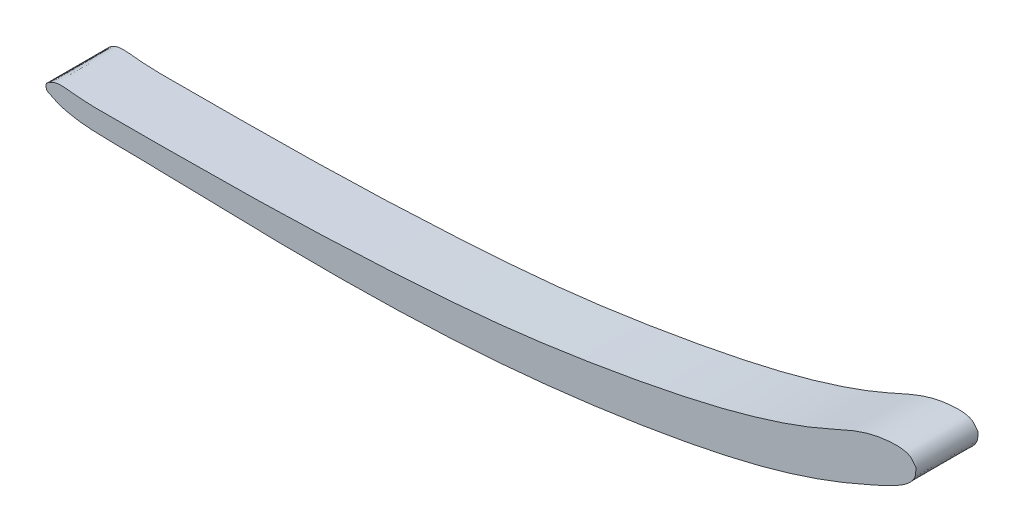
ISO-10303-21;
HEADER;
FILE_DESCRIPTION(('STEP AP214'),'2;1');
FILE_NAME('part.step','',(''),(''),'','','');
FILE_SCHEMA(('AUTOMOTIVE_DESIGN { 1 0 10303 214 1 1 1 1 }'));
ENDSEC;
DATA;
#1=APPLICATION_CONTEXT('core data for automotive mechanical design processes');
#2=APPLICATION_PROTOCOL_DEFINITION('international standard','automotive_design',2000,#1);
#3=PRODUCT_CONTEXT('',#1,'mechanical');
#4=PRODUCT('Part','Part','',(#3));
#5=PRODUCT_RELATED_PRODUCT_CATEGORY('part','',(#4));
#6=PRODUCT_DEFINITION_FORMATION('','',#4);
#7=PRODUCT_DEFINITION_CONTEXT('part definition',#1,'design');
#8=PRODUCT_DEFINITION('design','',#6,#7);
#9=PRODUCT_DEFINITION_SHAPE('','',#8);
#10=(LENGTH_UNIT() NAMED_UNIT(*) SI_UNIT(.MILLI.,.METRE.));
#11=(NAMED_UNIT(*) PLANE_ANGLE_UNIT() SI_UNIT($,.RADIAN.));
#12=(NAMED_UNIT(*) SI_UNIT($,.STERADIAN.) SOLID_ANGLE_UNIT());
#13=UNCERTAINTY_MEASURE_WITH_UNIT(LENGTH_MEASURE(1.E-05),#10,'distance_accuracy_value','');
#14=(GEOMETRIC_REPRESENTATION_CONTEXT(3) GLOBAL_UNCERTAINTY_ASSIGNED_CONTEXT((#13)) GLOBAL_UNIT_ASSIGNED_CONTEXT((#10,
#11,#12)) REPRESENTATION_CONTEXT('',''));
#15=CARTESIAN_POINT('',(0.,0.,0.));
#16=DIRECTION('',(0.,0.,1.));
#17=DIRECTION('',(1.,0.,0.));
#18=AXIS2_PLACEMENT_3D('',#15,#16,#17);
#19=CARTESIAN_POINT('',(51.0593514216579,0.,444.));
#20=CARTESIAN_POINT('',(51.0408393798769,0.0756062276242309,444.));
#21=CARTESIAN_POINT('',(50.9959182037949,0.138901396177157,444.));
#22=CARTESIAN_POINT('',(50.9011827807727,0.259665454383967,444.));
#23=CARTESIAN_POINT('',(50.8502622702264,0.317059667251623,444.));
#24=CARTESIAN_POINT('',(50.7012943591155,0.492432647017621,444.));
#25=CARTESIAN_POINT('',(50.6026258318228,0.611174293313033,444.));
#26=CARTESIAN_POINT('',(50.4368862485133,0.768409018394423,444.));
#27=CARTESIAN_POINT('',(50.3790864703461,0.817579181589201,444.));
#28=CARTESIAN_POINT('',(50.2545565695869,0.904582224288797,444.));
#29=CARTESIAN_POINT('',(50.1876959812607,0.942962253995774,444.));
#30=CARTESIAN_POINT('',(49.9788053204208,1.04279111512755,444.));
#31=CARTESIAN_POINT('',(49.8331340594548,1.08753760717468,444.));
#32=CARTESIAN_POINT('',(49.5356805351122,1.15624432500802,444.));
#33=CARTESIAN_POINT('',(49.3832322594025,1.1795610472741,444.));
#34=CARTESIAN_POINT('',(49.0800936413062,1.21444227965473,444.));
#35=CARTESIAN_POINT('',(48.9285952093711,1.22567965297453,444.));
#36=CARTESIAN_POINT('',(48.4742869094483,1.24302568772786,444.));
#37=CARTESIAN_POINT('',(48.1716470755255,1.23425278084605,444.));
#38=CARTESIAN_POINT('',(47.2640570461538,1.17909827380079,444.));
#39=CARTESIAN_POINT('',(46.6575695003602,1.09825145199031,444.));
#40=CARTESIAN_POINT('',(45.4720954086965,0.871934228606083,444.));
#41=CARTESIAN_POINT('',(44.8902140927814,0.723727884275258,444.));
#42=CARTESIAN_POINT('',(43.1750079301051,0.180840438068999,444.));
#43=CARTESIAN_POINT('',(42.0692648444786,-0.303386137989248,444.));
#44=CARTESIAN_POINT('',(39.8636503340226,-1.28855438392098,444.));
#45=CARTESIAN_POINT('',(38.7605059553471,-1.78020460474326,444.));
#46=CARTESIAN_POINT('',(36.5246308861651,-2.68154480231819,444.));
#47=CARTESIAN_POINT('',(35.3933300323557,-3.09519572443481,444.));
#48=CARTESIAN_POINT('',(33.1126356565822,-3.87237711072388,444.));
#49=CARTESIAN_POINT('',(31.9633450851073,-4.23619276918752,444.));
#50=CARTESIAN_POINT('',(29.6517074690219,-4.92765493698269,444.));
#51=CARTESIAN_POINT('',(28.4882151645929,-5.25408741052308,444.));
#52=CARTESIAN_POINT('',(26.1519977262055,-5.86745777659797,444.));
#53=CARTESIAN_POINT('',(24.9791742201242,-6.1550286912202,444.));
#54=CARTESIAN_POINT('',(21.4498923606462,-6.97391105988387,444.));
#55=CARTESIAN_POINT('',(19.0842597373433,-7.46462804151096,444.));
#56=CARTESIAN_POINT('',(14.3414536751976,-8.3745975061382,444.));
#57=CARTESIAN_POINT('',(11.9631499765223,-8.79293472418868,444.));
#58=CARTESIAN_POINT('',(7.19502192095206,-9.56842616891049,444.));
#59=CARTESIAN_POINT('',(4.80601582892226,-9.92510311757525,444.));
#60=CARTESIAN_POINT('',(0.0162993345377976,-10.5561520012107,444.));
#61=CARTESIAN_POINT('',(-2.38294583312734,-10.8273785967303,444.));
#62=CARTESIAN_POINT('',(-7.18983674924165,-11.2850051676654,444.));
#63=CARTESIAN_POINT('',(-9.59769306684337,-11.4729192053696,444.));
#64=CARTESIAN_POINT('',(-14.4167871780939,-11.7978646046983,444.));
#65=CARTESIAN_POINT('',(-16.8273017984838,-11.9363800811893,444.));
#66=CARTESIAN_POINT('',(-21.6495384580478,-12.1835149462487,444.));
#67=CARTESIAN_POINT('',(-24.0613142617866,-12.290803106434,444.));
#68=CARTESIAN_POINT('',(-28.8865195992256,-12.4644325267137,444.));
#69=CARTESIAN_POINT('',(-31.2999555929873,-12.530613833549,444.));
#70=CARTESIAN_POINT('',(-36.1283393208823,-12.6255452562685,444.));
#71=CARTESIAN_POINT('',(-38.5433423478169,-12.6547179827178,444.));
#72=CARTESIAN_POINT('',(-43.3732850317947,-12.6976528765733,444.));
#73=CARTESIAN_POINT('',(-45.7883074208213,-12.713090321412,444.));
#74=CARTESIAN_POINT('',(-49.4108658567439,-12.7301233535666,444.));
#75=CARTESIAN_POINT('',(-50.6183963970574,-12.7340299513783,444.));
#76=CARTESIAN_POINT('',(-52.4296948655007,-12.7334552918043,444.));
#77=CARTESIAN_POINT('',(-53.0334634876988,-12.7341284211406,444.));
#78=CARTESIAN_POINT('',(-54.2409804475092,-12.72836220265,444.));
#79=CARTESIAN_POINT('',(-54.8449700787845,-12.7223191022672,444.));
#80=CARTESIAN_POINT('',(-56.0505622332064,-12.6749283400332,444.));
#81=CARTESIAN_POINT('',(-56.65235286349,-12.6351331299431,444.));
#82=CARTESIAN_POINT('',(-57.8531807766124,-12.5114544324461,444.));
#83=CARTESIAN_POINT('',(-58.4524483100156,-12.425178931146,444.));
#84=CARTESIAN_POINT('',(-59.3567262547239,-12.4297231719929,444.));
#85=CARTESIAN_POINT('',(-59.6636444213334,-12.4562469102543,444.));
#86=CARTESIAN_POINT('',(-60.0925168667073,-12.5918230415854,444.));
#87=CARTESIAN_POINT('',(-60.2311444676702,-12.6549428996684,444.));
#88=CARTESIAN_POINT('',(-60.4985770861348,-12.801169870921,444.));
#89=CARTESIAN_POINT('',(-60.6264445110533,-12.8841843652963,444.));
#90=CARTESIAN_POINT('',(-60.8161373711667,-13.0119939986879,444.));
#91=CARTESIAN_POINT('',(-60.880800429903,-13.0555216346178,444.));
#92=CARTESIAN_POINT('',(-60.9748099318818,-13.1740473989639,444.));
#93=CARTESIAN_POINT('',(-61.0037363499786,-13.2481436679429,444.));
#94=CARTESIAN_POINT('',(-61.0229521376291,-13.3989372395297,444.));
#95=CARTESIAN_POINT('',(-61.0146292235168,-13.4748475629253,444.));
#96=CARTESIAN_POINT('',(-60.9982646775088,-13.6259380644475,444.));
#97=CARTESIAN_POINT('',(-60.9868981725538,-13.7019070665447,444.));
#98=CARTESIAN_POINT('',(-60.9381944627111,-13.8454389020756,444.));
#99=CARTESIAN_POINT('',(-60.897920599721,-13.9126087594414,444.));
#100=CARTESIAN_POINT('',(-60.7790963428574,-14.0088745454242,444.));
#101=CARTESIAN_POINT('',(-60.7102501702357,-14.0399131725784,444.));
#102=CARTESIAN_POINT('',(-60.5721181419146,-14.1011937315078,444.));
#103=CARTESIAN_POINT('',(-60.502863354517,-14.1314880897842,444.));
#104=CARTESIAN_POINT('',(-60.3665972652445,-14.1967114411682,444.));
#105=CARTESIAN_POINT('',(-60.2989966974578,-14.2304337915973,444.));
#106=CARTESIAN_POINT('',(-60.0969752167291,-14.3332282818373,444.));
#107=CARTESIAN_POINT('',(-59.9633135084408,-14.4038840199395,444.));
#108=CARTESIAN_POINT('',(-59.6909196120011,-14.5346191604885,444.));
#109=CARTESIAN_POINT('',(-59.5514309769309,-14.5941661897652,444.));
#110=CARTESIAN_POINT('',(-59.1292254741715,-14.7552071278612,444.));
#111=CARTESIAN_POINT('',(-58.8431098222935,-14.8413056604456,444.));
#112=CARTESIAN_POINT('',(-57.9780813727092,-15.0690193725004,444.));
#113=CARTESIAN_POINT('',(-57.3923634598421,-15.1794868392656,444.));
#114=CARTESIAN_POINT('',(-56.2068879267632,-15.3361605868355,444.));
#115=CARTESIAN_POINT('',(-55.6075599012478,-15.3829476496219,444.));
#116=CARTESIAN_POINT('',(-54.411156281399,-15.4480922448599,444.));
#117=CARTESIAN_POINT('',(-53.8123452626019,-15.4663319383334,444.));
#118=CARTESIAN_POINT('',(-52.0151867764723,-15.5039841345761,444.));
#119=CARTESIAN_POINT('',(-50.8164460265298,-15.5110205731138,444.));
#120=CARTESIAN_POINT('',(-48.4194461456832,-15.5380006315566,444.));
#121=CARTESIAN_POINT('',(-47.2210115479603,-15.5558505370189,444.));
#122=CARTESIAN_POINT('',(-43.6259626732439,-15.6264092367086,444.));
#123=CARTESIAN_POINT('',(-41.229578192644,-15.6916579625873,444.));
#124=CARTESIAN_POINT('',(-36.4367054159065,-15.8144282369873,444.));
#125=CARTESIAN_POINT('',(-34.0401534917351,-15.8704085449361,444.));
#126=CARTESIAN_POINT('',(-26.8493637999602,-15.9853040937488,444.));
#127=CARTESIAN_POINT('',(-22.0547558851412,-15.9898924230387,444.));
#128=CARTESIAN_POINT('',(-12.4697001875732,-15.7623410606474,444.));
#129=CARTESIAN_POINT('',(-7.679179465265,-15.5362740692693,444.));
#130=CARTESIAN_POINT('',(1.87731538954823,-14.7834302293905,444.));
#131=CARTESIAN_POINT('',(6.64675655678977,-14.2562719318843,444.));
#132=CARTESIAN_POINT('',(13.7687398936705,-13.2582502207188,444.));
#133=CARTESIAN_POINT('',(16.1368157057646,-12.890566679725,444.));
#134=CARTESIAN_POINT('',(20.8601333704666,-12.079284732611,444.));
#135=CARTESIAN_POINT('',(23.215548510165,-11.6345228337592,444.));
#136=CARTESIAN_POINT('',(27.9060145830239,-10.6336113763827,444.));
#137=CARTESIAN_POINT('',(30.2372702954241,-10.0771713544806,444.));
#138=CARTESIAN_POINT('',(34.8573417619791,-8.79430376073975,444.));
#139=CARTESIAN_POINT('',(37.1442453216568,-8.06722051173042,444.));
#140=CARTESIAN_POINT('',(41.6470420137467,-6.41414633903081,444.));
#141=CARTESIAN_POINT('',(43.8622961061986,-5.48966448349994,444.));
#142=CARTESIAN_POINT('',(46.5887594975215,-4.24194506238798,444.));
#143=CARTESIAN_POINT('',(47.1320635782808,-3.98777199104919,444.));
#144=CARTESIAN_POINT('',(47.9377017946104,-3.58793746054889,444.));
#145=CARTESIAN_POINT('',(48.2045691876618,-3.45093018282644,444.));
#146=CARTESIAN_POINT('',(48.7315143959145,-3.16463704161449,444.));
#147=CARTESIAN_POINT('',(48.9915502734107,-3.01622932215589,444.));
#148=CARTESIAN_POINT('',(49.4963234073578,-2.6959938294423,444.));
#149=CARTESIAN_POINT('',(49.7411290010227,-2.524270670925,444.));
#150=CARTESIAN_POINT('',(50.2039624656595,-2.13983139745658,444.));
#151=CARTESIAN_POINT('',(50.4183180413865,-1.92789852878916,444.));
#152=CARTESIAN_POINT('',(50.6966382249769,-1.57257953735229,444.));
#153=CARTESIAN_POINT('',(50.7824048017047,-1.44757786808697,444.));
#154=CARTESIAN_POINT('',(50.9247009828561,-1.18371931924835,444.));
#155=CARTESIAN_POINT('',(50.9830052702174,-1.0412630449034,444.));
#156=CARTESIAN_POINT('',(51.0423500137643,-0.748895987657039,444.));
#157=CARTESIAN_POINT('',(51.0439301613678,-0.598896034571195,444.));
#158=CARTESIAN_POINT('',(51.0504851131704,-0.374329118797118,444.));
#159=CARTESIAN_POINT('',(51.0560954820982,-0.29955821724087,444.));
#160=CARTESIAN_POINT('',(51.068519282998,-0.15004617545343,444.));
#161=CARTESIAN_POINT('',(51.0778634634388,-0.0756062276242309,444.));
#162=CARTESIAN_POINT('',(51.0593514216579,0.,444.));
#163=B_SPLINE_CURVE_WITH_KNOTS('',3,(#19,#20,#21,#22,#23,#24,#25,#26,#27,#28,#29,#30,#31,#32,
#33,#34,#35,#36,#37,#38,#39,#40,#41,#42,#43,#44,#45,#46,#47,#48,#49,#50,#51,#52,#53,#54,#55,#56,
#57,#58,#59,#60,#61,#62,#63,#64,#65,#66,#67,#68,#69,#70,#71,#72,#73,#74,#75,#76,#77,#78,#79,#80,
#81,#82,#83,#84,#85,#86,#87,#88,#89,#90,#91,#92,#93,#94,#95,#96,#97,#98,#99,#100,#101,#102,#103,
#104,#105,#106,#107,#108,#109,#110,#111,#112,#113,#114,#115,#116,#117,#118,#119,#120,#121,#122,
#123,#124,#125,#126,#127,#128,#129,#130,#131,#132,#133,#134,#135,#136,#137,#138,#139,#140,#141,
#142,#143,#144,#145,#146,#147,#148,#149,#150,#151,#152,#153,#154,#155,#156,#157,#158,#159,#160,
#161,#162),.UNSPECIFIED.,.T.,.F.,(4,2,2,2,2,2,2,2,2,2,2,2,2,2,2,2,2,2,2,2,2,2,2,2,2,2,2,2,2,2,2,
2,2,2,2,2,2,2,2,2,2,2,2,2,2,2,2,2,2,2,2,2,2,2,2,2,2,2,2,2,2,2,2,2,2,2,2,2,2,2,2,4),(0.,
0.000976562499999973,0.00195312499999995,0.00390624999999989,0.0048828124999999,
0.0058593749999999,0.00781249999999991,0.00976562499999993,0.0117187499999999,0.015625,
0.0234375000000001,0.0312500000000002,0.0468750000000004,0.0625000000000006,0.0781250000000008,
0.0937500000000009,0.109375000000001,0.125000000000001,0.156250000000002,0.187500000000002,
0.218750000000002,0.250000000000003,0.281250000000003,0.312500000000004,0.343750000000004,
0.375000000000004,0.406250000000005,0.437500000000005,0.453125000000005,0.460937500000006,
0.468750000000006,0.476562500000006,0.484375000000006,0.488281250000006,0.490234375000006,
0.492187500000006,0.493164062500006,0.494140625000006,0.495117187500006,0.496093750000006,
0.497070312500006,0.498046875000006,0.499023437500006,0.500000000000006,0.501953125000006,
0.503906250000006,0.507812500000006,0.515625000000005,0.523437500000005,0.531250000000005,
0.546875000000005,0.562500000000005,0.593750000000005,0.625000000000004,0.687500000000004,
0.750000000000003,0.812500000000002,0.843750000000002,0.875000000000002,0.906250000000001,
0.937500000000001,0.968750000000001,0.976562500000001,0.980468750000001,0.984375,0.98828125,
0.9921875,0.994140625,0.99609375,0.998046875,0.9990234375,1.),.UNSPECIFIED.);
#164=DIRECTION('',(0.,0.,-1.));
#165=VECTOR('',#164,1.);
#166=SURFACE_OF_LINEAR_EXTRUSION('',#163,#165);
#167=CARTESIAN_POINT('',(51.0593514216579,0.,444.));
#168=CARTESIAN_POINT('',(51.0778634634388,-0.0756062276242309,444.));
#169=CARTESIAN_POINT('',(51.068519282998,-0.15004617545343,444.));
#170=CARTESIAN_POINT('',(51.0560954820982,-0.29955821724087,444.));
#171=CARTESIAN_POINT('',(51.0504851131704,-0.374329118797118,444.));
#172=CARTESIAN_POINT('',(51.0439301613678,-0.598896034571195,444.));
#173=CARTESIAN_POINT('',(51.0423500137643,-0.748895987657039,444.));
#174=CARTESIAN_POINT('',(50.9830052702174,-1.0412630449034,444.));
#175=CARTESIAN_POINT('',(50.9247009828561,-1.18371931924835,444.));
#176=CARTESIAN_POINT('',(50.7824048017047,-1.44757786808697,444.));
#177=CARTESIAN_POINT('',(50.6966382249769,-1.57257953735229,444.));
#178=CARTESIAN_POINT('',(50.4183180413865,-1.92789852878916,444.));
#179=CARTESIAN_POINT('',(50.2039624656595,-2.13983139745658,444.));
#180=CARTESIAN_POINT('',(49.7411290010227,-2.524270670925,444.));
#181=CARTESIAN_POINT('',(49.4963234073578,-2.6959938294423,444.));
#182=CARTESIAN_POINT('',(48.9915502734107,-3.01622932215589,444.));
#183=CARTESIAN_POINT('',(48.7315143959145,-3.16463704161449,444.));
#184=CARTESIAN_POINT('',(48.2045691876618,-3.45093018282644,444.));
#185=CARTESIAN_POINT('',(47.9377017946104,-3.58793746054889,444.));
#186=CARTESIAN_POINT('',(47.1320635782808,-3.98777199104919,444.));
#187=CARTESIAN_POINT('',(46.5887594975215,-4.24194506238798,444.));
#188=CARTESIAN_POINT('',(43.8622961061986,-5.48966448349994,444.));
#189=CARTESIAN_POINT('',(41.6470420137467,-6.41414633903081,444.));
#190=CARTESIAN_POINT('',(37.1442453216568,-8.06722051173042,444.));
#191=CARTESIAN_POINT('',(34.8573417619791,-8.79430376073975,444.));
#192=CARTESIAN_POINT('',(30.2372702954241,-10.0771713544806,444.));
#193=CARTESIAN_POINT('',(27.9060145830239,-10.6336113763827,444.));
#194=CARTESIAN_POINT('',(23.215548510165,-11.6345228337592,444.));
#195=CARTESIAN_POINT('',(20.8601333704666,-12.079284732611,444.));
#196=CARTESIAN_POINT('',(16.1368157057646,-12.890566679725,444.));
#197=CARTESIAN_POINT('',(13.7687398936705,-13.2582502207188,444.));
#198=CARTESIAN_POINT('',(6.64675655678977,-14.2562719318843,444.));
#199=CARTESIAN_POINT('',(1.87731538954823,-14.7834302293905,444.));
#200=CARTESIAN_POINT('',(-7.679179465265,-15.5362740692693,444.));
#201=CARTESIAN_POINT('',(-12.4697001875732,-15.7623410606474,444.));
#202=CARTESIAN_POINT('',(-22.0547558851412,-15.9898924230387,444.));
#203=CARTESIAN_POINT('',(-26.8493637999602,-15.9853040937488,444.));
#204=CARTESIAN_POINT('',(-34.0401534917351,-15.8704085449361,444.));
#205=CARTESIAN_POINT('',(-36.4367054159065,-15.8144282369873,444.));
#206=CARTESIAN_POINT('',(-41.229578192644,-15.6916579625873,444.));
#207=CARTESIAN_POINT('',(-43.6259626732439,-15.6264092367086,444.));
#208=CARTESIAN_POINT('',(-47.2210115479603,-15.5558505370189,444.));
#209=CARTESIAN_POINT('',(-48.4194461456832,-15.5380006315566,444.));
#210=CARTESIAN_POINT('',(-50.8164460265298,-15.5110205731138,444.));
#211=CARTESIAN_POINT('',(-52.0151867764723,-15.5039841345761,444.));
#212=CARTESIAN_POINT('',(-53.8123452626019,-15.4663319383334,444.));
#213=CARTESIAN_POINT('',(-54.411156281399,-15.4480922448599,444.));
#214=CARTESIAN_POINT('',(-55.6075599012478,-15.3829476496219,444.));
#215=CARTESIAN_POINT('',(-56.2068879267632,-15.3361605868355,444.));
#216=CARTESIAN_POINT('',(-57.3923634598421,-15.1794868392656,444.));
#217=CARTESIAN_POINT('',(-57.9780813727092,-15.0690193725004,444.));
#218=CARTESIAN_POINT('',(-58.8431098222935,-14.8413056604456,444.));
#219=CARTESIAN_POINT('',(-59.1292254741715,-14.7552071278612,444.));
#220=CARTESIAN_POINT('',(-59.5514309769309,-14.5941661897652,444.));
#221=CARTESIAN_POINT('',(-59.6909196120011,-14.5346191604885,444.));
#222=CARTESIAN_POINT('',(-59.9633135084408,-14.4038840199395,444.));
#223=CARTESIAN_POINT('',(-60.0969752167291,-14.3332282818373,444.));
#224=CARTESIAN_POINT('',(-60.2989966974578,-14.2304337915973,444.));
#225=CARTESIAN_POINT('',(-60.3665972652445,-14.1967114411682,444.));
#226=CARTESIAN_POINT('',(-60.502863354517,-14.1314880897842,444.));
#227=CARTESIAN_POINT('',(-60.5721181419146,-14.1011937315078,444.));
#228=CARTESIAN_POINT('',(-60.7102501702357,-14.0399131725784,444.));
#229=CARTESIAN_POINT('',(-60.7790963428574,-14.0088745454242,444.));
#230=CARTESIAN_POINT('',(-60.897920599721,-13.9126087594414,444.));
#231=CARTESIAN_POINT('',(-60.9381944627111,-13.8454389020756,444.));
#232=CARTESIAN_POINT('',(-60.9868981725538,-13.7019070665447,444.));
#233=CARTESIAN_POINT('',(-60.9982646775088,-13.6259380644475,444.));
#234=CARTESIAN_POINT('',(-61.0146292235168,-13.4748475629253,444.));
#235=CARTESIAN_POINT('',(-61.0229521376291,-13.3989372395297,444.));
#236=CARTESIAN_POINT('',(-61.0037363499786,-13.2481436679429,444.));
#237=CARTESIAN_POINT('',(-60.9748099318818,-13.1740473989639,444.));
#238=CARTESIAN_POINT('',(-60.880800429903,-13.0555216346178,444.));
#239=CARTESIAN_POINT('',(-60.8161373711667,-13.0119939986879,444.));
#240=CARTESIAN_POINT('',(-60.6264445110533,-12.8841843652963,444.));
#241=CARTESIAN_POINT('',(-60.4985770861348,-12.801169870921,444.));
#242=CARTESIAN_POINT('',(-60.2311444676702,-12.6549428996684,444.));
#243=CARTESIAN_POINT('',(-60.0925168667073,-12.5918230415854,444.));
#244=CARTESIAN_POINT('',(-59.6636444213334,-12.4562469102543,444.));
#245=CARTESIAN_POINT('',(-59.3567262547239,-12.4297231719929,444.));
#246=CARTESIAN_POINT('',(-58.4524483100156,-12.425178931146,444.));
#247=CARTESIAN_POINT('',(-57.8531807766124,-12.5114544324461,444.));
#248=CARTESIAN_POINT('',(-56.65235286349,-12.6351331299431,444.));
#249=CARTESIAN_POINT('',(-56.0505622332064,-12.6749283400332,444.));
#250=CARTESIAN_POINT('',(-54.8449700787845,-12.7223191022672,444.));
#251=CARTESIAN_POINT('',(-54.2409804475092,-12.72836220265,444.));
#252=CARTESIAN_POINT('',(-53.0334634876988,-12.7341284211406,444.));
#253=CARTESIAN_POINT('',(-52.4296948655007,-12.7334552918043,444.));
#254=CARTESIAN_POINT('',(-50.6183963970574,-12.7340299513783,444.));
#255=CARTESIAN_POINT('',(-49.4108658567439,-12.7301233535666,444.));
#256=CARTESIAN_POINT('',(-45.7883074208213,-12.713090321412,444.));
#257=CARTESIAN_POINT('',(-43.3732850317947,-12.6976528765733,444.));
#258=CARTESIAN_POINT('',(-38.5433423478169,-12.6547179827178,444.));
#259=CARTESIAN_POINT('',(-36.1283393208823,-12.6255452562685,444.));
#260=CARTESIAN_POINT('',(-31.2999555929873,-12.530613833549,444.));
#261=CARTESIAN_POINT('',(-28.8865195992256,-12.4644325267137,444.));
#262=CARTESIAN_POINT('',(-24.0613142617866,-12.290803106434,444.));
#263=CARTESIAN_POINT('',(-21.6495384580478,-12.1835149462487,444.));
#264=CARTESIAN_POINT('',(-16.8273017984838,-11.9363800811893,444.));
#265=CARTESIAN_POINT('',(-14.4167871780939,-11.7978646046983,444.));
#266=CARTESIAN_POINT('',(-9.59769306684337,-11.4729192053696,444.));
#267=CARTESIAN_POINT('',(-7.18983674924165,-11.2850051676654,444.));
#268=CARTESIAN_POINT('',(-2.38294583312734,-10.8273785967303,444.));
#269=CARTESIAN_POINT('',(0.0162993345377976,-10.5561520012107,444.));
#270=CARTESIAN_POINT('',(4.80601582892226,-9.92510311757525,444.));
#271=CARTESIAN_POINT('',(7.19502192095206,-9.56842616891049,444.));
#272=CARTESIAN_POINT('',(11.9631499765223,-8.79293472418868,444.));
#273=CARTESIAN_POINT('',(14.3414536751976,-8.3745975061382,444.));
#274=CARTESIAN_POINT('',(19.0842597373433,-7.46462804151096,444.));
#275=CARTESIAN_POINT('',(21.4498923606462,-6.97391105988387,444.));
#276=CARTESIAN_POINT('',(24.9791742201242,-6.1550286912202,444.));
#277=CARTESIAN_POINT('',(26.1519977262055,-5.86745777659797,444.));
#278=CARTESIAN_POINT('',(28.4882151645929,-5.25408741052308,444.));
#279=CARTESIAN_POINT('',(29.6517074690219,-4.92765493698269,444.));
#280=CARTESIAN_POINT('',(31.9633450851073,-4.23619276918752,444.));
#281=CARTESIAN_POINT('',(33.1126356565822,-3.87237711072388,444.));
#282=CARTESIAN_POINT('',(35.3933300323557,-3.09519572443481,444.));
#283=CARTESIAN_POINT('',(36.5246308861651,-2.68154480231819,444.));
#284=CARTESIAN_POINT('',(38.7605059553471,-1.78020460474326,444.));
#285=CARTESIAN_POINT('',(39.8636503340226,-1.28855438392098,444.));
#286=CARTESIAN_POINT('',(42.0692648444786,-0.303386137989248,444.));
#287=CARTESIAN_POINT('',(43.1750079301051,0.180840438068999,444.));
#288=CARTESIAN_POINT('',(44.8902140927814,0.723727884275258,444.));
#289=CARTESIAN_POINT('',(45.4720954086965,0.871934228606083,444.));
#290=CARTESIAN_POINT('',(46.6575695003602,1.09825145199031,444.));
#291=CARTESIAN_POINT('',(47.2640570461538,1.17909827380079,444.));
#292=CARTESIAN_POINT('',(48.1716470755255,1.23425278084605,444.));
#293=CARTESIAN_POINT('',(48.4742869094483,1.24302568772786,444.));
#294=CARTESIAN_POINT('',(48.9285952093711,1.22567965297453,444.));
#295=CARTESIAN_POINT('',(49.0800936413062,1.21444227965473,444.));
#296=CARTESIAN_POINT('',(49.3832322594025,1.1795610472741,444.));
#297=CARTESIAN_POINT('',(49.5356805351122,1.15624432500802,444.));
#298=CARTESIAN_POINT('',(49.8331340594548,1.08753760717468,444.));
#299=CARTESIAN_POINT('',(49.9788053204208,1.04279111512755,444.));
#300=CARTESIAN_POINT('',(50.1876959812607,0.942962253995774,444.));
#301=CARTESIAN_POINT('',(50.2545565695869,0.904582224288797,444.));
#302=CARTESIAN_POINT('',(50.3790864703461,0.817579181589201,444.));
#303=CARTESIAN_POINT('',(50.4368862485133,0.768409018394423,444.));
#304=CARTESIAN_POINT('',(50.6026258318228,0.611174293313033,444.));
#305=CARTESIAN_POINT('',(50.7012943591155,0.492432647017621,444.));
#306=CARTESIAN_POINT('',(50.8502622702264,0.317059667251623,444.));
#307=CARTESIAN_POINT('',(50.9011827807727,0.259665454383967,444.));
#308=CARTESIAN_POINT('',(50.9959182037949,0.138901396177157,444.));
#309=CARTESIAN_POINT('',(51.0408393798769,0.0756062276242309,444.));
#310=CARTESIAN_POINT('',(51.0593514216579,0.,444.));
#311=B_SPLINE_CURVE_WITH_KNOTS('',3,(#167,#168,#169,#170,#171,#172,#173,#174,#175,#176,#177,
#178,#179,#180,#181,#182,#183,#184,#185,#186,#187,#188,#189,#190,#191,#192,#193,#194,#195,#196,
#197,#198,#199,#200,#201,#202,#203,#204,#205,#206,#207,#208,#209,#210,#211,#212,#213,#214,#215,
#216,#217,#218,#219,#220,#221,#222,#223,#224,#225,#226,#227,#228,#229,#230,#231,#232,#233,#234,
#235,#236,#237,#238,#239,#240,#241,#242,#243,#244,#245,#246,#247,#248,#249,#250,#251,#252,#253,
#254,#255,#256,#257,#258,#259,#260,#261,#262,#263,#264,#265,#266,#267,#268,#269,#270,#271,#272,
#273,#274,#275,#276,#277,#278,#279,#280,#281,#282,#283,#284,#285,#286,#287,#288,#289,#290,#291,
#292,#293,#294,#295,#296,#297,#298,#299,#300,#301,#302,#303,#304,#305,#306,#307,#308,#309,#310),
.UNSPECIFIED.,.T.,.F.,(4,2,2,2,2,2,2,2,2,2,2,2,2,2,2,2,2,2,2,2,2,2,2,2,2,2,2,2,2,2,2,2,2,2,2,2,
2,2,2,2,2,2,2,2,2,2,2,2,2,2,2,2,2,2,2,2,2,2,2,2,2,2,2,2,2,2,2,2,2,2,2,4),(0.,0.0009765625,
0.001953125,0.00390624999999989,0.00585937499999989,0.00781249999999978,0.0117187499999997,
0.0156249999999996,0.0195312499999994,0.0234374999999993,0.0312499999999992,0.0624999999999989,
0.0937499999999987,0.124999999999998,0.156249999999998,0.187499999999998,0.249999999999997,
0.312499999999996,0.374999999999996,0.406249999999995,0.437499999999995,0.453124999999995,
0.468749999999995,0.476562499999995,0.484374999999995,0.492187499999994,0.496093749999994,
0.498046874999994,0.499999999999994,0.500976562499994,0.501953124999994,0.502929687499994,
0.503906249999994,0.504882812499994,0.505859374999994,0.506835937499994,0.507812499999994,
0.509765624999994,0.511718749999994,0.515624999999994,0.523437499999994,0.531249999999994,
0.539062499999994,0.546874999999995,0.562499999999995,0.593749999999995,0.624999999999996,
0.656249999999996,0.687499999999996,0.718749999999997,0.749999999999997,0.781249999999998,
0.812499999999998,0.843749999999998,0.874999999999999,0.890624999999999,0.906249999999999,
0.921874999999999,0.937499999999999,0.953125,0.96875,0.9765625,0.984375,0.98828125,0.990234375,
0.9921875,0.994140625,0.9951171875,0.99609375,0.998046875,0.9990234375,1.),.UNSPECIFIED.);
#312=CARTESIAN_POINT('',(51.0593514216579,0.,444.));
#313=VERTEX_POINT('',#312);
#314=EDGE_CURVE('E10',#313,#313,#311,.F.);
#315=ORIENTED_EDGE('',*,*,#314,.F.);
#316=EDGE_LOOP('',(#315));
#317=FACE_BOUND('',#316,.T.);
#318=CARTESIAN_POINT('',(51.0593514216579,0.,436.));
#319=CARTESIAN_POINT('',(51.0408393798769,0.0756062276242309,436.));
#320=CARTESIAN_POINT('',(50.9959182037949,0.138901396177157,436.));
#321=CARTESIAN_POINT('',(50.9011827807727,0.259665454383967,436.));
#322=CARTESIAN_POINT('',(50.8502622702264,0.317059667251623,436.));
#323=CARTESIAN_POINT('',(50.7012943591155,0.492432647017621,436.));
#324=CARTESIAN_POINT('',(50.6026258318228,0.611174293313033,436.));
#325=CARTESIAN_POINT('',(50.4368862485133,0.768409018394423,436.));
#326=CARTESIAN_POINT('',(50.3790864703461,0.817579181589201,436.));
#327=CARTESIAN_POINT('',(50.2545565695869,0.904582224288797,436.));
#328=CARTESIAN_POINT('',(50.1876959812607,0.942962253995774,436.));
#329=CARTESIAN_POINT('',(49.9788053204208,1.04279111512755,436.));
#330=CARTESIAN_POINT('',(49.8331340594548,1.08753760717468,436.));
#331=CARTESIAN_POINT('',(49.5356805351122,1.15624432500802,436.));
#332=CARTESIAN_POINT('',(49.3832322594025,1.1795610472741,436.));
#333=CARTESIAN_POINT('',(49.0800936413062,1.21444227965473,436.));
#334=CARTESIAN_POINT('',(48.9285952093711,1.22567965297453,436.));
#335=CARTESIAN_POINT('',(48.4742869094483,1.24302568772786,436.));
#336=CARTESIAN_POINT('',(48.1716470755255,1.23425278084605,436.));
#337=CARTESIAN_POINT('',(47.2640570461538,1.17909827380079,436.));
#338=CARTESIAN_POINT('',(46.6575695003602,1.09825145199031,436.));
#339=CARTESIAN_POINT('',(45.4720954086965,0.871934228606083,436.));
#340=CARTESIAN_POINT('',(44.8902140927814,0.723727884275258,436.));
#341=CARTESIAN_POINT('',(43.1750079301051,0.180840438068999,436.));
#342=CARTESIAN_POINT('',(42.0692648444786,-0.303386137989248,436.));
#343=CARTESIAN_POINT('',(39.8636503340226,-1.28855438392098,436.));
#344=CARTESIAN_POINT('',(38.7605059553471,-1.78020460474326,436.));
#345=CARTESIAN_POINT('',(36.5246308861651,-2.68154480231819,436.));
#346=CARTESIAN_POINT('',(35.3933300323557,-3.09519572443481,436.));
#347=CARTESIAN_POINT('',(33.1126356565822,-3.87237711072388,436.));
#348=CARTESIAN_POINT('',(31.9633450851073,-4.23619276918752,436.));
#349=CARTESIAN_POINT('',(29.6517074690219,-4.92765493698269,436.));
#350=CARTESIAN_POINT('',(28.4882151645929,-5.25408741052308,436.));
#351=CARTESIAN_POINT('',(26.1519977262055,-5.86745777659797,436.));
#352=CARTESIAN_POINT('',(24.9791742201242,-6.1550286912202,436.));
#353=CARTESIAN_POINT('',(21.4498923606462,-6.97391105988387,436.));
#354=CARTESIAN_POINT('',(19.0842597373433,-7.46462804151096,436.));
#355=CARTESIAN_POINT('',(14.3414536751976,-8.3745975061382,436.));
#356=CARTESIAN_POINT('',(11.9631499765223,-8.79293472418868,436.));
#357=CARTESIAN_POINT('',(7.19502192095206,-9.56842616891049,436.));
#358=CARTESIAN_POINT('',(4.80601582892226,-9.92510311757525,436.));
#359=CARTESIAN_POINT('',(0.0162993345377976,-10.5561520012107,436.));
#360=CARTESIAN_POINT('',(-2.38294583312734,-10.8273785967303,436.));
#361=CARTESIAN_POINT('',(-7.18983674924165,-11.2850051676654,436.));
#362=CARTESIAN_POINT('',(-9.59769306684337,-11.4729192053696,436.));
#363=CARTESIAN_POINT('',(-14.4167871780939,-11.7978646046983,436.));
#364=CARTESIAN_POINT('',(-16.8273017984838,-11.9363800811893,436.));
#365=CARTESIAN_POINT('',(-21.6495384580478,-12.1835149462487,436.));
#366=CARTESIAN_POINT('',(-24.0613142617866,-12.290803106434,436.));
#367=CARTESIAN_POINT('',(-28.8865195992256,-12.4644325267137,436.));
#368=CARTESIAN_POINT('',(-31.2999555929873,-12.530613833549,436.));
#369=CARTESIAN_POINT('',(-36.1283393208823,-12.6255452562685,436.));
#370=CARTESIAN_POINT('',(-38.5433423478169,-12.6547179827178,436.));
#371=CARTESIAN_POINT('',(-43.3732850317947,-12.6976528765733,436.));
#372=CARTESIAN_POINT('',(-45.7883074208213,-12.713090321412,436.));
#373=CARTESIAN_POINT('',(-49.4108658567439,-12.7301233535666,436.));
#374=CARTESIAN_POINT('',(-50.6183963970574,-12.7340299513783,436.));
#375=CARTESIAN_POINT('',(-52.4296948655007,-12.7334552918043,436.));
#376=CARTESIAN_POINT('',(-53.0334634876988,-12.7341284211406,436.));
#377=CARTESIAN_POINT('',(-54.2409804475092,-12.72836220265,436.));
#378=CARTESIAN_POINT('',(-54.8449700787845,-12.7223191022672,436.));
#379=CARTESIAN_POINT('',(-56.0505622332064,-12.6749283400332,436.));
#380=CARTESIAN_POINT('',(-56.65235286349,-12.6351331299431,436.));
#381=CARTESIAN_POINT('',(-57.8531807766124,-12.5114544324461,436.));
#382=CARTESIAN_POINT('',(-58.4524483100156,-12.425178931146,436.));
#383=CARTESIAN_POINT('',(-59.3567262547239,-12.4297231719929,436.));
#384=CARTESIAN_POINT('',(-59.6636444213334,-12.4562469102543,436.));
#385=CARTESIAN_POINT('',(-60.0925168667073,-12.5918230415854,436.));
#386=CARTESIAN_POINT('',(-60.2311444676702,-12.6549428996684,436.));
#387=CARTESIAN_POINT('',(-60.4985770861348,-12.801169870921,436.));
#388=CARTESIAN_POINT('',(-60.6264445110533,-12.8841843652963,436.));
#389=CARTESIAN_POINT('',(-60.8161373711667,-13.0119939986879,436.));
#390=CARTESIAN_POINT('',(-60.880800429903,-13.0555216346178,436.));
#391=CARTESIAN_POINT('',(-60.9748099318818,-13.1740473989639,436.));
#392=CARTESIAN_POINT('',(-61.0037363499786,-13.2481436679429,436.));
#393=CARTESIAN_POINT('',(-61.0229521376291,-13.3989372395297,436.));
#394=CARTESIAN_POINT('',(-61.0146292235168,-13.4748475629253,436.));
#395=CARTESIAN_POINT('',(-60.9982646775088,-13.6259380644475,436.));
#396=CARTESIAN_POINT('',(-60.9868981725538,-13.7019070665447,436.));
#397=CARTESIAN_POINT('',(-60.9381944627111,-13.8454389020756,436.));
#398=CARTESIAN_POINT('',(-60.897920599721,-13.9126087594414,436.));
#399=CARTESIAN_POINT('',(-60.7790963428574,-14.0088745454242,436.));
#400=CARTESIAN_POINT('',(-60.7102501702357,-14.0399131725784,436.));
#401=CARTESIAN_POINT('',(-60.5721181419146,-14.1011937315078,436.));
#402=CARTESIAN_POINT('',(-60.502863354517,-14.1314880897842,436.));
#403=CARTESIAN_POINT('',(-60.3665972652445,-14.1967114411682,436.));
#404=CARTESIAN_POINT('',(-60.2989966974578,-14.2304337915973,436.));
#405=CARTESIAN_POINT('',(-60.0969752167291,-14.3332282818373,436.));
#406=CARTESIAN_POINT('',(-59.9633135084408,-14.4038840199395,436.));
#407=CARTESIAN_POINT('',(-59.6909196120011,-14.5346191604885,436.));
#408=CARTESIAN_POINT('',(-59.5514309769309,-14.5941661897652,436.));
#409=CARTESIAN_POINT('',(-59.1292254741715,-14.7552071278612,436.));
#410=CARTESIAN_POINT('',(-58.8431098222935,-14.8413056604456,436.));
#411=CARTESIAN_POINT('',(-57.9780813727092,-15.0690193725004,436.));
#412=CARTESIAN_POINT('',(-57.3923634598421,-15.1794868392656,436.));
#413=CARTESIAN_POINT('',(-56.2068879267632,-15.3361605868355,436.));
#414=CARTESIAN_POINT('',(-55.6075599012478,-15.3829476496219,436.));
#415=CARTESIAN_POINT('',(-54.411156281399,-15.4480922448599,436.));
#416=CARTESIAN_POINT('',(-53.8123452626019,-15.4663319383334,436.));
#417=CARTESIAN_POINT('',(-52.0151867764723,-15.5039841345761,436.));
#418=CARTESIAN_POINT('',(-50.8164460265298,-15.5110205731138,436.));
#419=CARTESIAN_POINT('',(-48.4194461456832,-15.5380006315566,436.));
#420=CARTESIAN_POINT('',(-47.2210115479603,-15.5558505370189,436.));
#421=CARTESIAN_POINT('',(-43.6259626732439,-15.6264092367086,436.));
#422=CARTESIAN_POINT('',(-41.229578192644,-15.6916579625873,436.));
#423=CARTESIAN_POINT('',(-36.4367054159065,-15.8144282369873,436.));
#424=CARTESIAN_POINT('',(-34.0401534917351,-15.8704085449361,436.));
#425=CARTESIAN_POINT('',(-26.8493637999602,-15.9853040937488,436.));
#426=CARTESIAN_POINT('',(-22.0547558851412,-15.9898924230387,436.));
#427=CARTESIAN_POINT('',(-12.4697001875732,-15.7623410606474,436.));
#428=CARTESIAN_POINT('',(-7.679179465265,-15.5362740692693,436.));
#429=CARTESIAN_POINT('',(1.87731538954823,-14.7834302293905,436.));
#430=CARTESIAN_POINT('',(6.64675655678977,-14.2562719318843,436.));
#431=CARTESIAN_POINT('',(13.7687398936705,-13.2582502207188,436.));
#432=CARTESIAN_POINT('',(16.1368157057646,-12.890566679725,436.));
#433=CARTESIAN_POINT('',(20.8601333704666,-12.079284732611,436.));
#434=CARTESIAN_POINT('',(23.215548510165,-11.6345228337592,436.));
#435=CARTESIAN_POINT('',(27.9060145830239,-10.6336113763827,436.));
#436=CARTESIAN_POINT('',(30.2372702954241,-10.0771713544806,436.));
#437=CARTESIAN_POINT('',(34.8573417619791,-8.79430376073975,436.));
#438=CARTESIAN_POINT('',(37.1442453216568,-8.06722051173042,436.));
#439=CARTESIAN_POINT('',(41.6470420137467,-6.41414633903081,436.));
#440=CARTESIAN_POINT('',(43.8622961061986,-5.48966448349994,436.));
#441=CARTESIAN_POINT('',(46.5887594975215,-4.24194506238798,436.));
#442=CARTESIAN_POINT('',(47.1320635782808,-3.98777199104919,436.));
#443=CARTESIAN_POINT('',(47.9377017946104,-3.58793746054889,436.));
#444=CARTESIAN_POINT('',(48.2045691876618,-3.45093018282644,436.));
#445=CARTESIAN_POINT('',(48.7315143959145,-3.16463704161449,436.));
#446=CARTESIAN_POINT('',(48.9915502734107,-3.01622932215589,436.));
#447=CARTESIAN_POINT('',(49.4963234073578,-2.6959938294423,436.));
#448=CARTESIAN_POINT('',(49.7411290010227,-2.524270670925,436.));
#449=CARTESIAN_POINT('',(50.2039624656595,-2.13983139745658,436.));
#450=CARTESIAN_POINT('',(50.4183180413865,-1.92789852878916,436.));
#451=CARTESIAN_POINT('',(50.6966382249769,-1.57257953735229,436.));
#452=CARTESIAN_POINT('',(50.7824048017047,-1.44757786808697,436.));
#453=CARTESIAN_POINT('',(50.9247009828561,-1.18371931924835,436.));
#454=CARTESIAN_POINT('',(50.9830052702174,-1.0412630449034,436.));
#455=CARTESIAN_POINT('',(51.0423500137643,-0.748895987657039,436.));
#456=CARTESIAN_POINT('',(51.0439301613678,-0.598896034571195,436.));
#457=CARTESIAN_POINT('',(51.0504851131704,-0.374329118797118,436.));
#458=CARTESIAN_POINT('',(51.0560954820982,-0.29955821724087,436.));
#459=CARTESIAN_POINT('',(51.068519282998,-0.15004617545343,436.));
#460=CARTESIAN_POINT('',(51.0778634634388,-0.0756062276242309,436.));
#461=CARTESIAN_POINT('',(51.0593514216579,0.,436.));
#462=B_SPLINE_CURVE_WITH_KNOTS('',3,(#318,#319,#320,#321,#322,#323,#324,#325,#326,#327,#328,
#329,#330,#331,#332,#333,#334,#335,#336,#337,#338,#339,#340,#341,#342,#343,#344,#345,#346,#347,
#348,#349,#350,#351,#352,#353,#354,#355,#356,#357,#358,#359,#360,#361,#362,#363,#364,#365,#366,
#367,#368,#369,#370,#371,#372,#373,#374,#375,#376,#377,#378,#379,#380,#381,#382,#383,#384,#385,
#386,#387,#388,#389,#390,#391,#392,#393,#394,#395,#396,#397,#398,#399,#400,#401,#402,#403,#404,
#405,#406,#407,#408,#409,#410,#411,#412,#413,#414,#415,#416,#417,#418,#419,#420,#421,#422,#423,
#424,#425,#426,#427,#428,#429,#430,#431,#432,#433,#434,#435,#436,#437,#438,#439,#440,#441,#442,
#443,#444,#445,#446,#447,#448,#449,#450,#451,#452,#453,#454,#455,#456,#457,#458,#459,#460,#461),
.UNSPECIFIED.,.T.,.F.,(4,2,2,2,2,2,2,2,2,2,2,2,2,2,2,2,2,2,2,2,2,2,2,2,2,2,2,2,2,2,2,2,2,2,2,2,
2,2,2,2,2,2,2,2,2,2,2,2,2,2,2,2,2,2,2,2,2,2,2,2,2,2,2,2,2,2,2,2,2,2,2,4),(0.,
0.000976562499999973,0.00195312499999995,0.00390624999999989,0.0048828124999999,
0.0058593749999999,0.00781249999999991,0.00976562499999993,0.0117187499999999,0.015625,
0.0234375000000001,0.0312500000000002,0.0468750000000004,0.0625000000000006,0.0781250000000008,
0.0937500000000009,0.109375000000001,0.125000000000001,0.156250000000002,0.187500000000002,
0.218750000000002,0.250000000000003,0.281250000000003,0.312500000000004,0.343750000000004,
0.375000000000004,0.406250000000005,0.437500000000005,0.453125000000005,0.460937500000006,
0.468750000000006,0.476562500000006,0.484375000000006,0.488281250000006,0.490234375000006,
0.492187500000006,0.493164062500006,0.494140625000006,0.495117187500006,0.496093750000006,
0.497070312500006,0.498046875000006,0.499023437500006,0.500000000000006,0.501953125000006,
0.503906250000006,0.507812500000006,0.515625000000005,0.523437500000005,0.531250000000005,
0.546875000000005,0.562500000000005,0.593750000000005,0.625000000000004,0.687500000000004,
0.750000000000003,0.812500000000002,0.843750000000002,0.875000000000002,0.906250000000001,
0.937500000000001,0.968750000000001,0.976562500000001,0.980468750000001,0.984375,0.98828125,
0.9921875,0.994140625,0.99609375,0.998046875,0.9990234375,1.),.UNSPECIFIED.);
#463=CARTESIAN_POINT('',(51.0593514216579,0.,436.));
#464=VERTEX_POINT('',#463);
#465=EDGE_CURVE('E38',#464,#464,#462,.T.);
#466=ORIENTED_EDGE('',*,*,#465,.T.);
#467=EDGE_LOOP('',(#466));
#468=FACE_BOUND('',#467,.T.);
#469=ADVANCED_FACE('F28',(#317,#468),#166,.F.);
#470=CARTESIAN_POINT('',(-60.2316562038827,-14.2646986216767,444.));
#471=DIRECTION('',(0.,0.,-1.));
#472=DIRECTION('',(-1.,0.,0.));
#473=AXIS2_PLACEMENT_3D('',#470,#471,#472);
#474=PLANE('',#473);
#475=ORIENTED_EDGE('',*,*,#314,.T.);
#476=EDGE_LOOP('',(#475));
#477=FACE_BOUND('',#476,.T.);
#478=ADVANCED_FACE('F69',(#477),#474,.F.);
#479=CARTESIAN_POINT('',(-60.2316562038827,-14.2646986216767,436.));
#480=DIRECTION('',(0.,0.,-1.));
#481=DIRECTION('',(-1.,0.,0.));
#482=AXIS2_PLACEMENT_3D('',#479,#480,#481);
#483=PLANE('',#482);
#484=ORIENTED_EDGE('',*,*,#465,.F.);
#485=EDGE_LOOP('',(#484));
#486=FACE_BOUND('',#485,.T.);
#487=ADVANCED_FACE('F77',(#486),#483,.T.);
#488=CLOSED_SHELL('',(#469,#478,#487));
#489=MANIFOLD_SOLID_BREP('B2',#488);
#490=ADVANCED_BREP_SHAPE_REPRESENTATION('',(#18,#489),#14);
#491=SHAPE_DEFINITION_REPRESENTATION(#9,#490);
ENDSEC;
END-ISO-10303-21;
